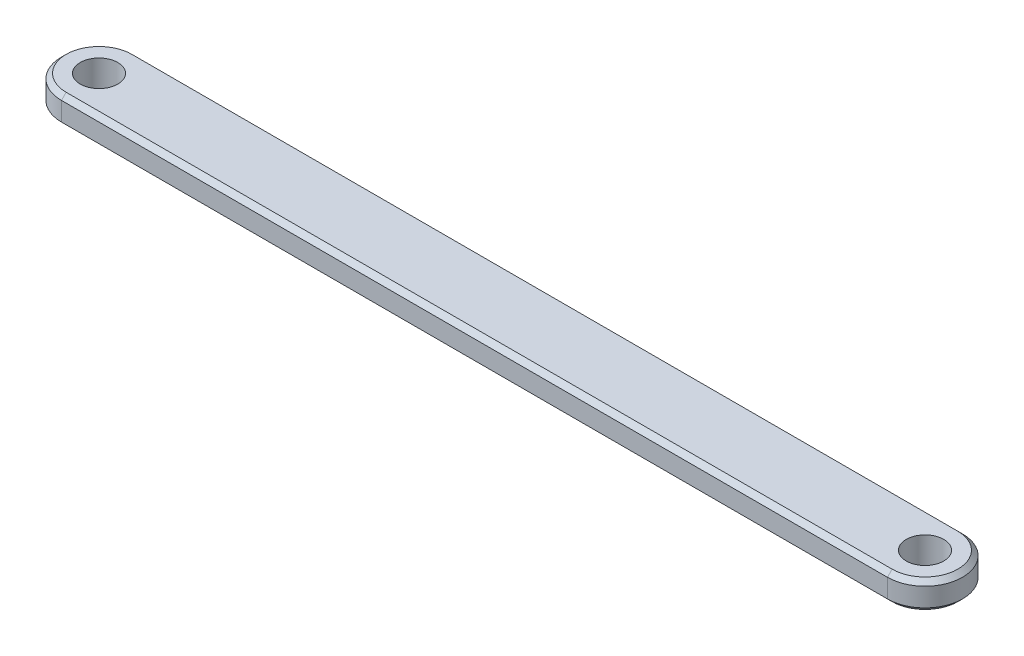
ISO-10303-21;
HEADER;
FILE_DESCRIPTION(('STEP AP214'),'2;1');
FILE_NAME('part.step','',(''),(''),'','','');
FILE_SCHEMA(('AUTOMOTIVE_DESIGN { 1 0 10303 214 1 1 1 1 }'));
ENDSEC;
DATA;
#1=APPLICATION_CONTEXT('core data for automotive mechanical design processes');
#2=APPLICATION_PROTOCOL_DEFINITION('international standard','automotive_design',2000,#1);
#3=PRODUCT_CONTEXT('',#1,'mechanical');
#4=PRODUCT('Part','Part','',(#3));
#5=PRODUCT_RELATED_PRODUCT_CATEGORY('part','',(#4));
#6=PRODUCT_DEFINITION_FORMATION('','',#4);
#7=PRODUCT_DEFINITION_CONTEXT('part definition',#1,'design');
#8=PRODUCT_DEFINITION('design','',#6,#7);
#9=PRODUCT_DEFINITION_SHAPE('','',#8);
#10=(LENGTH_UNIT() NAMED_UNIT(*) SI_UNIT(.MILLI.,.METRE.));
#11=(NAMED_UNIT(*) PLANE_ANGLE_UNIT() SI_UNIT($,.RADIAN.));
#12=(NAMED_UNIT(*) SI_UNIT($,.STERADIAN.) SOLID_ANGLE_UNIT());
#13=UNCERTAINTY_MEASURE_WITH_UNIT(LENGTH_MEASURE(1.E-05),#10,'distance_accuracy_value','');
#14=(GEOMETRIC_REPRESENTATION_CONTEXT(3) GLOBAL_UNCERTAINTY_ASSIGNED_CONTEXT((#13)) GLOBAL_UNIT_ASSIGNED_CONTEXT((#10,
#11,#12)) REPRESENTATION_CONTEXT('',''));
#15=CARTESIAN_POINT('',(0.,0.,0.));
#16=DIRECTION('',(0.,0.,1.));
#17=DIRECTION('',(1.,0.,0.));
#18=AXIS2_PLACEMENT_3D('',#15,#16,#17);
#19=CARTESIAN_POINT('',(0.,1.5,0.));
#20=DIRECTION('',(0.,1.,0.));
#21=DIRECTION('',(0.,0.,1.));
#22=AXIS2_PLACEMENT_3D('',#19,#20,#21);
#23=PLANE('',#22);
#24=DIRECTION('',(-1.,0.,0.));
#25=VECTOR('',#24,1.);
#26=CARTESIAN_POINT('',(0.,1.5,-3.49999999999999));
#27=LINE('',#26,#25);
#28=CARTESIAN_POINT('',(88.,1.5,-3.49999999999999));
#29=VERTEX_POINT('',#28);
#30=CARTESIAN_POINT('',(0.,1.5,-3.49999999999999));
#31=VERTEX_POINT('',#30);
#32=EDGE_CURVE('E70',#29,#31,#27,.T.);
#33=ORIENTED_EDGE('',*,*,#32,.T.);
#34=CARTESIAN_POINT('',(0.,1.5,0.));
#35=DIRECTION('',(0.,1.,0.));
#36=DIRECTION('',(0.,0.,1.));
#37=AXIS2_PLACEMENT_3D('',#34,#35,#36);
#38=CIRCLE('',#37,3.49999999999999);
#39=CARTESIAN_POINT('',(0.,1.5,3.49999999999999));
#40=VERTEX_POINT('',#39);
#41=EDGE_CURVE('E11',#31,#40,#38,.T.);
#42=ORIENTED_EDGE('',*,*,#41,.T.);
#43=DIRECTION('',(1.,0.,0.));
#44=VECTOR('',#43,1.);
#45=CARTESIAN_POINT('',(88.,1.5,3.49999999999999));
#46=LINE('',#45,#44);
#47=CARTESIAN_POINT('',(88.,1.5,3.49999999999999));
#48=VERTEX_POINT('',#47);
#49=EDGE_CURVE('E55',#40,#48,#46,.T.);
#50=ORIENTED_EDGE('',*,*,#49,.T.);
#51=CARTESIAN_POINT('',(88.,1.5,0.));
#52=DIRECTION('',(0.,1.,0.));
#53=DIRECTION('',(0.,0.,1.));
#54=AXIS2_PLACEMENT_3D('',#51,#52,#53);
#55=CIRCLE('',#54,3.49999999999999);
#56=EDGE_CURVE('E192',#48,#29,#55,.T.);
#57=ORIENTED_EDGE('',*,*,#56,.T.);
#58=EDGE_LOOP('',(#33,#42,#50,#57));
#59=FACE_BOUND('',#58,.T.);
#60=CARTESIAN_POINT('',(0.,1.5,0.));
#61=DIRECTION('',(0.,1.,0.));
#62=DIRECTION('',(0.,0.,1.));
#63=AXIS2_PLACEMENT_3D('',#60,#61,#62);
#64=CIRCLE('',#63,2.);
#65=CARTESIAN_POINT('',(0.,1.5,2.));
#66=VERTEX_POINT('',#65);
#67=EDGE_CURVE('E148',#66,#66,#64,.T.);
#68=ORIENTED_EDGE('',*,*,#67,.F.);
#69=EDGE_LOOP('',(#68));
#70=FACE_BOUND('',#69,.T.);
#71=CARTESIAN_POINT('',(88.,1.5,0.));
#72=DIRECTION('',(0.,1.,0.));
#73=DIRECTION('',(0.,0.,1.));
#74=AXIS2_PLACEMENT_3D('',#71,#72,#73);
#75=CIRCLE('',#74,2.);
#76=CARTESIAN_POINT('',(88.,1.5,2.));
#77=VERTEX_POINT('',#76);
#78=EDGE_CURVE('E224',#77,#77,#75,.T.);
#79=ORIENTED_EDGE('',*,*,#78,.F.);
#80=EDGE_LOOP('',(#79));
#81=FACE_BOUND('',#80,.T.);
#82=ADVANCED_FACE('F44',(#59,#70,#81),#23,.T.);
#83=CARTESIAN_POINT('',(0.,-1.5,0.));
#84=DIRECTION('',(0.,1.,0.));
#85=DIRECTION('',(0.,0.,1.));
#86=AXIS2_PLACEMENT_3D('',#83,#84,#85);
#87=PLANE('',#86);
#88=CARTESIAN_POINT('',(0.,-1.5,0.));
#89=DIRECTION('',(0.,1.,0.));
#90=DIRECTION('',(0.,0.,1.));
#91=AXIS2_PLACEMENT_3D('',#88,#89,#90);
#92=CIRCLE('',#91,3.5);
#93=CARTESIAN_POINT('',(0.,-1.5,3.5));
#94=VERTEX_POINT('',#93);
#95=CARTESIAN_POINT('',(0.,-1.5,-3.5));
#96=VERTEX_POINT('',#95);
#97=EDGE_CURVE('E172',#94,#96,#92,.F.);
#98=ORIENTED_EDGE('',*,*,#97,.T.);
#99=DIRECTION('',(1.,0.,0.));
#100=VECTOR('',#99,1.);
#101=CARTESIAN_POINT('',(0.,-1.5,-3.5));
#102=LINE('',#101,#100);
#103=CARTESIAN_POINT('',(88.,-1.5,-3.5));
#104=VERTEX_POINT('',#103);
#105=EDGE_CURVE('E141',#96,#104,#102,.T.);
#106=ORIENTED_EDGE('',*,*,#105,.T.);
#107=CARTESIAN_POINT('',(88.,-1.5,0.));
#108=DIRECTION('',(0.,1.,0.));
#109=DIRECTION('',(0.,0.,1.));
#110=AXIS2_PLACEMENT_3D('',#107,#108,#109);
#111=CIRCLE('',#110,3.5);
#112=CARTESIAN_POINT('',(88.,-1.5,3.5));
#113=VERTEX_POINT('',#112);
#114=EDGE_CURVE('E169',#104,#113,#111,.F.);
#115=ORIENTED_EDGE('',*,*,#114,.T.);
#116=DIRECTION('',(-1.,0.,0.));
#117=VECTOR('',#116,1.);
#118=CARTESIAN_POINT('',(0.,-1.5,3.5));
#119=LINE('',#118,#117);
#120=EDGE_CURVE('E166',#113,#94,#119,.T.);
#121=ORIENTED_EDGE('',*,*,#120,.T.);
#122=EDGE_LOOP('',(#98,#106,#115,#121));
#123=FACE_BOUND('',#122,.T.);
#124=CARTESIAN_POINT('',(0.,-1.5,0.));
#125=DIRECTION('',(0.,1.,0.));
#126=DIRECTION('',(0.,0.,1.));
#127=AXIS2_PLACEMENT_3D('',#124,#125,#126);
#128=CIRCLE('',#127,2.);
#129=CARTESIAN_POINT('',(0.,-1.5,2.));
#130=VERTEX_POINT('',#129);
#131=EDGE_CURVE('E155',#130,#130,#128,.T.);
#132=ORIENTED_EDGE('',*,*,#131,.T.);
#133=EDGE_LOOP('',(#132));
#134=FACE_BOUND('',#133,.T.);
#135=CARTESIAN_POINT('',(88.,-1.5,0.));
#136=DIRECTION('',(0.,1.,0.));
#137=DIRECTION('',(0.,0.,1.));
#138=AXIS2_PLACEMENT_3D('',#135,#136,#137);
#139=CIRCLE('',#138,2.);
#140=CARTESIAN_POINT('',(88.,-1.5,2.));
#141=VERTEX_POINT('',#140);
#142=EDGE_CURVE('E213',#141,#141,#139,.T.);
#143=ORIENTED_EDGE('',*,*,#142,.T.);
#144=EDGE_LOOP('',(#143));
#145=FACE_BOUND('',#144,.T.);
#146=ADVANCED_FACE('F232',(#123,#134,#145),#87,.F.);
#147=CARTESIAN_POINT('',(0.,1.5,0.));
#148=DIRECTION('',(0.,-1.,0.));
#149=DIRECTION('',(0.,0.,-1.));
#150=AXIS2_PLACEMENT_3D('',#147,#148,#149);
#151=CYLINDRICAL_SURFACE('',#150,4.);
#152=DIRECTION('',(0.,-1.,0.));
#153=VECTOR('',#152,1.);
#154=CARTESIAN_POINT('',(0.,1.5,-4.));
#155=LINE('',#154,#153);
#156=CARTESIAN_POINT('',(0.,0.999999999999989,-4.));
#157=VERTEX_POINT('',#156);
#158=CARTESIAN_POINT('',(0.,-1.,-4.));
#159=VERTEX_POINT('',#158);
#160=EDGE_CURVE('E137',#157,#159,#155,.T.);
#161=ORIENTED_EDGE('',*,*,#160,.T.);
#162=CARTESIAN_POINT('',(0.,-1.,0.));
#163=DIRECTION('',(0.,1.,0.));
#164=DIRECTION('',(0.,0.,1.));
#165=AXIS2_PLACEMENT_3D('',#162,#163,#164);
#166=CIRCLE('',#165,4.);
#167=CARTESIAN_POINT('',(0.,-1.,4.));
#168=VERTEX_POINT('',#167);
#169=EDGE_CURVE('E140',#159,#168,#166,.T.);
#170=ORIENTED_EDGE('',*,*,#169,.T.);
#171=DIRECTION('',(0.,-1.,0.));
#172=VECTOR('',#171,1.);
#173=CARTESIAN_POINT('',(0.,1.5,4.));
#174=LINE('',#173,#172);
#175=CARTESIAN_POINT('',(0.,0.999999999999989,4.));
#176=VERTEX_POINT('',#175);
#177=EDGE_CURVE('E131',#176,#168,#174,.T.);
#178=ORIENTED_EDGE('',*,*,#177,.F.);
#179=CARTESIAN_POINT('',(0.,0.999999999999989,0.));
#180=DIRECTION('',(0.,1.,0.));
#181=DIRECTION('',(0.,0.,1.));
#182=AXIS2_PLACEMENT_3D('',#179,#180,#181);
#183=CIRCLE('',#182,4.);
#184=EDGE_CURVE('E116',#176,#157,#183,.F.);
#185=ORIENTED_EDGE('',*,*,#184,.T.);
#186=EDGE_LOOP('',(#161,#170,#178,#185));
#187=FACE_BOUND('',#186,.T.);
#188=ADVANCED_FACE('F136',(#187),#151,.T.);
#189=CARTESIAN_POINT('',(0.,1.5,4.));
#190=DIRECTION('',(0.,0.,-1.));
#191=DIRECTION('',(-1.,0.,0.));
#192=AXIS2_PLACEMENT_3D('',#189,#190,#191);
#193=PLANE('',#192);
#194=ORIENTED_EDGE('',*,*,#177,.T.);
#195=DIRECTION('',(1.,0.,0.));
#196=VECTOR('',#195,1.);
#197=CARTESIAN_POINT('',(0.,-1.,4.));
#198=LINE('',#197,#196);
#199=CARTESIAN_POINT('',(88.,-1.,4.));
#200=VERTEX_POINT('',#199);
#201=EDGE_CURVE('E189',#168,#200,#198,.T.);
#202=ORIENTED_EDGE('',*,*,#201,.T.);
#203=DIRECTION('',(0.,-1.,0.));
#204=VECTOR('',#203,1.);
#205=CARTESIAN_POINT('',(88.,1.5,4.));
#206=LINE('',#205,#204);
#207=CARTESIAN_POINT('',(88.,0.999999999999989,4.));
#208=VERTEX_POINT('',#207);
#209=EDGE_CURVE('E152',#208,#200,#206,.T.);
#210=ORIENTED_EDGE('',*,*,#209,.F.);
#211=DIRECTION('',(-1.,0.,0.));
#212=VECTOR('',#211,1.);
#213=CARTESIAN_POINT('',(0.,0.999999999999989,4.));
#214=LINE('',#213,#212);
#215=EDGE_CURVE('E186',#208,#176,#214,.T.);
#216=ORIENTED_EDGE('',*,*,#215,.T.);
#217=EDGE_LOOP('',(#194,#202,#210,#216));
#218=FACE_BOUND('',#217,.T.);
#219=ADVANCED_FACE('F260',(#218),#193,.F.);
#220=CARTESIAN_POINT('',(88.,1.5,0.));
#221=DIRECTION('',(0.,-1.,0.));
#222=DIRECTION('',(0.,0.,-1.));
#223=AXIS2_PLACEMENT_3D('',#220,#221,#222);
#224=CYLINDRICAL_SURFACE('',#223,4.);
#225=ORIENTED_EDGE('',*,*,#209,.T.);
#226=CARTESIAN_POINT('',(88.,-1.,0.));
#227=DIRECTION('',(0.,1.,0.));
#228=DIRECTION('',(0.,0.,1.));
#229=AXIS2_PLACEMENT_3D('',#226,#227,#228);
#230=CIRCLE('',#229,4.);
#231=CARTESIAN_POINT('',(88.,-1.,-4.));
#232=VERTEX_POINT('',#231);
#233=EDGE_CURVE('E183',#200,#232,#230,.T.);
#234=ORIENTED_EDGE('',*,*,#233,.T.);
#235=DIRECTION('',(0.,-1.,0.));
#236=VECTOR('',#235,1.);
#237=CARTESIAN_POINT('',(88.,1.5,-4.));
#238=LINE('',#237,#236);
#239=CARTESIAN_POINT('',(88.,0.999999999999989,-4.));
#240=VERTEX_POINT('',#239);
#241=EDGE_CURVE('E147',#240,#232,#238,.T.);
#242=ORIENTED_EDGE('',*,*,#241,.F.);
#243=CARTESIAN_POINT('',(88.,0.999999999999989,0.));
#244=DIRECTION('',(0.,1.,0.));
#245=DIRECTION('',(0.,0.,1.));
#246=AXIS2_PLACEMENT_3D('',#243,#244,#245);
#247=CIRCLE('',#246,4.);
#248=EDGE_CURVE('E180',#240,#208,#247,.F.);
#249=ORIENTED_EDGE('',*,*,#248,.T.);
#250=EDGE_LOOP('',(#225,#234,#242,#249));
#251=FACE_BOUND('',#250,.T.);
#252=ADVANCED_FACE('F247',(#251),#224,.T.);
#253=CARTESIAN_POINT('',(0.,1.5,-4.));
#254=DIRECTION('',(0.,0.,1.));
#255=DIRECTION('',(1.,0.,0.));
#256=AXIS2_PLACEMENT_3D('',#253,#254,#255);
#257=PLANE('',#256);
#258=ORIENTED_EDGE('',*,*,#241,.T.);
#259=DIRECTION('',(-1.,0.,0.));
#260=VECTOR('',#259,1.);
#261=CARTESIAN_POINT('',(0.,-1.,-4.));
#262=LINE('',#261,#260);
#263=EDGE_CURVE('E130',#232,#159,#262,.T.);
#264=ORIENTED_EDGE('',*,*,#263,.T.);
#265=ORIENTED_EDGE('',*,*,#160,.F.);
#266=DIRECTION('',(1.,0.,0.));
#267=VECTOR('',#266,1.);
#268=CARTESIAN_POINT('',(88.,0.999999999999989,-4.));
#269=LINE('',#268,#267);
#270=EDGE_CURVE('E122',#157,#240,#269,.T.);
#271=ORIENTED_EDGE('',*,*,#270,.T.);
#272=EDGE_LOOP('',(#258,#264,#265,#271));
#273=FACE_BOUND('',#272,.T.);
#274=ADVANCED_FACE('F144',(#273),#257,.F.);
#275=CARTESIAN_POINT('',(0.,1.5,0.));
#276=DIRECTION('',(0.,-1.,0.));
#277=DIRECTION('',(0.,0.,-1.));
#278=AXIS2_PLACEMENT_3D('',#275,#276,#277);
#279=CYLINDRICAL_SURFACE('',#278,2.);
#280=ORIENTED_EDGE('',*,*,#67,.T.);
#281=EDGE_LOOP('',(#280));
#282=FACE_BOUND('',#281,.T.);
#283=ORIENTED_EDGE('',*,*,#131,.F.);
#284=EDGE_LOOP('',(#283));
#285=FACE_BOUND('',#284,.T.);
#286=ADVANCED_FACE('F235',(#282,#285),#279,.F.);
#287=CARTESIAN_POINT('',(88.,1.5,0.));
#288=DIRECTION('',(0.,-1.,0.));
#289=DIRECTION('',(0.,0.,-1.));
#290=AXIS2_PLACEMENT_3D('',#287,#288,#289);
#291=CYLINDRICAL_SURFACE('',#290,2.);
#292=ORIENTED_EDGE('',*,*,#78,.T.);
#293=EDGE_LOOP('',(#292));
#294=FACE_BOUND('',#293,.T.);
#295=ORIENTED_EDGE('',*,*,#142,.F.);
#296=EDGE_LOOP('',(#295));
#297=FACE_BOUND('',#296,.T.);
#298=ADVANCED_FACE('F237',(#294,#297),#291,.F.);
#299=CARTESIAN_POINT('',(0.,-1.,4.));
#300=DIRECTION('',(0.,0.707106781186547,-0.707106781186547));
#301=DIRECTION('',(1.,0.,0.));
#302=AXIS2_PLACEMENT_3D('',#299,#300,#301);
#303=PLANE('',#302);
#304=DIRECTION('',(0.,0.707106781186547,0.707106781186547));
#305=VECTOR('',#304,1.);
#306=CARTESIAN_POINT('',(0.,-1.5,3.5));
#307=LINE('',#306,#305);
#308=EDGE_CURVE('E205',#94,#168,#307,.T.);
#309=ORIENTED_EDGE('',*,*,#308,.F.);
#310=ORIENTED_EDGE('',*,*,#120,.F.);
#311=DIRECTION('',(0.,-0.707106781186547,-0.707106781186547));
#312=VECTOR('',#311,1.);
#313=CARTESIAN_POINT('',(88.,-1.,4.));
#314=LINE('',#313,#312);
#315=EDGE_CURVE('E209',#200,#113,#314,.T.);
#316=ORIENTED_EDGE('',*,*,#315,.F.);
#317=ORIENTED_EDGE('',*,*,#201,.F.);
#318=EDGE_LOOP('',(#309,#310,#316,#317));
#319=FACE_BOUND('',#318,.T.);
#320=ADVANCED_FACE('F244',(#319),#303,.F.);
#321=CARTESIAN_POINT('',(88.,-1.,0.));
#322=DIRECTION('',(0.,1.,0.));
#323=DIRECTION('',(0.,0.,1.));
#324=AXIS2_PLACEMENT_3D('',#321,#322,#323);
#325=CONICAL_SURFACE('',#324,4.,0.785398163397448);
#326=ORIENTED_EDGE('',*,*,#315,.T.);
#327=ORIENTED_EDGE('',*,*,#114,.F.);
#328=DIRECTION('',(0.,-0.707106781186547,0.707106781186547));
#329=VECTOR('',#328,1.);
#330=CARTESIAN_POINT('',(88.,-1.,-4.));
#331=LINE('',#330,#329);
#332=EDGE_CURVE('E202',#232,#104,#331,.T.);
#333=ORIENTED_EDGE('',*,*,#332,.F.);
#334=ORIENTED_EDGE('',*,*,#233,.F.);
#335=EDGE_LOOP('',(#326,#327,#333,#334));
#336=FACE_BOUND('',#335,.T.);
#337=ADVANCED_FACE('F281',(#336),#325,.T.);
#338=CARTESIAN_POINT('',(0.,-1.,0.));
#339=DIRECTION('',(0.,1.,0.));
#340=DIRECTION('',(0.,0.,1.));
#341=AXIS2_PLACEMENT_3D('',#338,#339,#340);
#342=CONICAL_SURFACE('',#341,4.,0.785398163397448);
#343=ORIENTED_EDGE('',*,*,#308,.T.);
#344=ORIENTED_EDGE('',*,*,#169,.F.);
#345=DIRECTION('',(0.,0.707106781186547,-0.707106781186547));
#346=VECTOR('',#345,1.);
#347=CARTESIAN_POINT('',(0.,-1.5,-3.5));
#348=LINE('',#347,#346);
#349=EDGE_CURVE('E199',#96,#159,#348,.T.);
#350=ORIENTED_EDGE('',*,*,#349,.F.);
#351=ORIENTED_EDGE('',*,*,#97,.F.);
#352=EDGE_LOOP('',(#343,#344,#350,#351));
#353=FACE_BOUND('',#352,.T.);
#354=ADVANCED_FACE('F274',(#353),#342,.T.);
#355=CARTESIAN_POINT('',(0.,-1.,-4.));
#356=DIRECTION('',(0.,0.707106781186547,0.707106781186547));
#357=DIRECTION('',(-1.,0.,0.));
#358=AXIS2_PLACEMENT_3D('',#355,#356,#357);
#359=PLANE('',#358);
#360=ORIENTED_EDGE('',*,*,#332,.T.);
#361=ORIENTED_EDGE('',*,*,#105,.F.);
#362=ORIENTED_EDGE('',*,*,#349,.T.);
#363=ORIENTED_EDGE('',*,*,#263,.F.);
#364=EDGE_LOOP('',(#360,#361,#362,#363));
#365=FACE_BOUND('',#364,.T.);
#366=ADVANCED_FACE('F268',(#365),#359,.F.);
#367=CARTESIAN_POINT('',(88.,1.5,0.));
#368=DIRECTION('',(0.,-1.,0.));
#369=DIRECTION('',(0.,0.,-1.));
#370=AXIS2_PLACEMENT_3D('',#367,#368,#369);
#371=CONICAL_SURFACE('',#370,3.49999999999999,0.785398163397452);
#372=DIRECTION('',(0.,0.707106781186545,-0.70710678118655));
#373=VECTOR('',#372,1.);
#374=CARTESIAN_POINT('',(88.,0.999999999999989,4.));
#375=LINE('',#374,#373);
#376=EDGE_CURVE('E119',#208,#48,#375,.T.);
#377=ORIENTED_EDGE('',*,*,#376,.F.);
#378=ORIENTED_EDGE('',*,*,#248,.F.);
#379=DIRECTION('',(0.,-0.707106781186545,-0.70710678118655));
#380=VECTOR('',#379,1.);
#381=CARTESIAN_POINT('',(88.,1.5,-3.49999999999999));
#382=LINE('',#381,#380);
#383=EDGE_CURVE('E49',#29,#240,#382,.T.);
#384=ORIENTED_EDGE('',*,*,#383,.F.);
#385=ORIENTED_EDGE('',*,*,#56,.F.);
#386=EDGE_LOOP('',(#377,#378,#384,#385));
#387=FACE_BOUND('',#386,.T.);
#388=ADVANCED_FACE('F47',(#387),#371,.T.);
#389=CARTESIAN_POINT('',(0.,1.5,-3.49999999999999));
#390=DIRECTION('',(0.,0.70710678118655,-0.707106781186545));
#391=DIRECTION('',(1.,0.,0.));
#392=AXIS2_PLACEMENT_3D('',#389,#390,#391);
#393=PLANE('',#392);
#394=ORIENTED_EDGE('',*,*,#383,.T.);
#395=ORIENTED_EDGE('',*,*,#270,.F.);
#396=DIRECTION('',(0.,-0.707106781186545,-0.70710678118655));
#397=VECTOR('',#396,1.);
#398=CARTESIAN_POINT('',(0.,1.5,-3.49999999999999));
#399=LINE('',#398,#397);
#400=EDGE_CURVE('E112',#31,#157,#399,.T.);
#401=ORIENTED_EDGE('',*,*,#400,.F.);
#402=ORIENTED_EDGE('',*,*,#32,.F.);
#403=EDGE_LOOP('',(#394,#395,#401,#402));
#404=FACE_BOUND('',#403,.T.);
#405=ADVANCED_FACE('F123',(#404),#393,.T.);
#406=CARTESIAN_POINT('',(0.,1.5,3.49999999999999));
#407=DIRECTION('',(0.,0.70710678118655,0.707106781186545));
#408=DIRECTION('',(-1.,0.,0.));
#409=AXIS2_PLACEMENT_3D('',#406,#407,#408);
#410=PLANE('',#409);
#411=ORIENTED_EDGE('',*,*,#376,.T.);
#412=ORIENTED_EDGE('',*,*,#49,.F.);
#413=DIRECTION('',(0.,0.707106781186545,-0.70710678118655));
#414=VECTOR('',#413,1.);
#415=CARTESIAN_POINT('',(0.,0.999999999999989,4.));
#416=LINE('',#415,#414);
#417=EDGE_CURVE('E63',#176,#40,#416,.T.);
#418=ORIENTED_EDGE('',*,*,#417,.F.);
#419=ORIENTED_EDGE('',*,*,#215,.F.);
#420=EDGE_LOOP('',(#411,#412,#418,#419));
#421=FACE_BOUND('',#420,.T.);
#422=ADVANCED_FACE('F300',(#421),#410,.T.);
#423=CARTESIAN_POINT('',(0.,1.5,0.));
#424=DIRECTION('',(0.,-1.,0.));
#425=DIRECTION('',(0.,0.,-1.));
#426=AXIS2_PLACEMENT_3D('',#423,#424,#425);
#427=CONICAL_SURFACE('',#426,3.49999999999999,0.785398163397452);
#428=ORIENTED_EDGE('',*,*,#400,.T.);
#429=ORIENTED_EDGE('',*,*,#184,.F.);
#430=ORIENTED_EDGE('',*,*,#417,.T.);
#431=ORIENTED_EDGE('',*,*,#41,.F.);
#432=EDGE_LOOP('',(#428,#429,#430,#431));
#433=FACE_BOUND('',#432,.T.);
#434=ADVANCED_FACE('F114',(#433),#427,.T.);
#435=CLOSED_SHELL('',(#82,#146,#188,#219,#252,#274,#286,#298,#320,#337,#354,#366,#388,#405,#422,#434));
#436=MANIFOLD_SOLID_BREP('B2',#435);
#437=ADVANCED_BREP_SHAPE_REPRESENTATION('',(#18,#436),#14);
#438=SHAPE_DEFINITION_REPRESENTATION(#9,#437);
ENDSEC;
END-ISO-10303-21;
